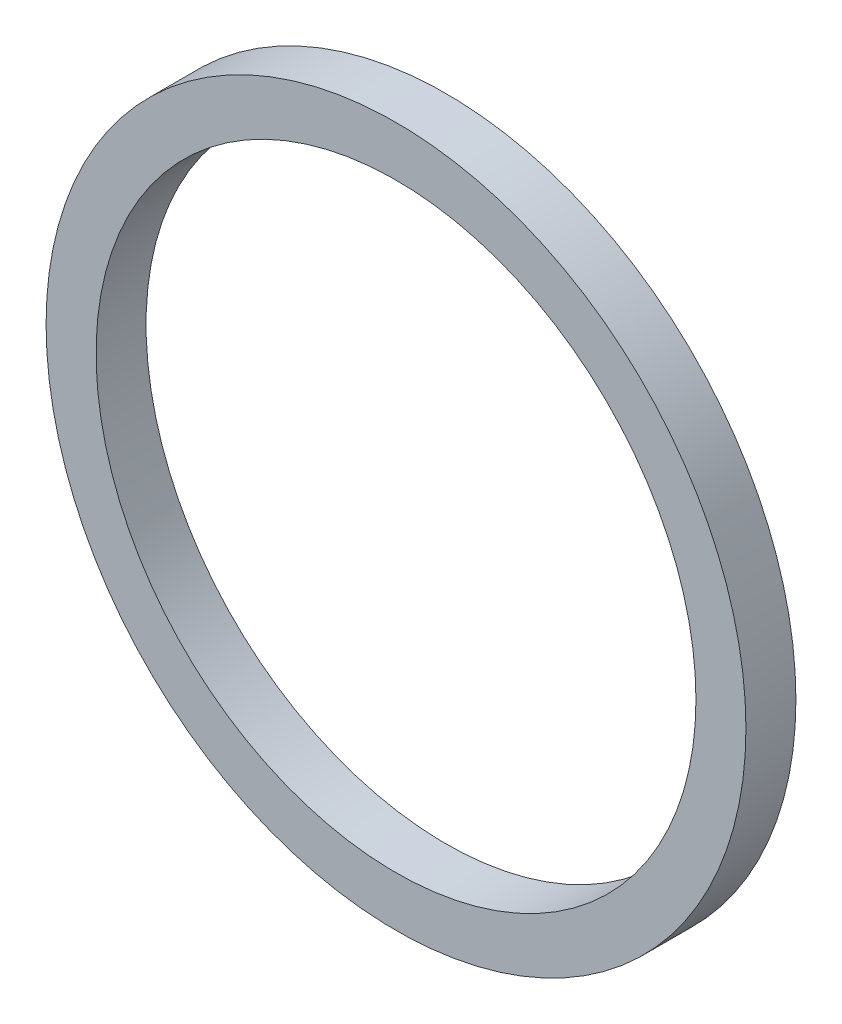
ISO-10303-21;
HEADER;
FILE_DESCRIPTION(('STEP AP214'),'2;1');
FILE_NAME('part.step','',(''),(''),'','','');
FILE_SCHEMA(('AUTOMOTIVE_DESIGN { 1 0 10303 214 1 1 1 1 }'));
ENDSEC;
DATA;
#1=APPLICATION_CONTEXT('core data for automotive mechanical design processes');
#2=APPLICATION_PROTOCOL_DEFINITION('international standard','automotive_design',2000,#1);
#3=PRODUCT_CONTEXT('',#1,'mechanical');
#4=PRODUCT('Part','Part','',(#3));
#5=PRODUCT_RELATED_PRODUCT_CATEGORY('part','',(#4));
#6=PRODUCT_DEFINITION_FORMATION('','',#4);
#7=PRODUCT_DEFINITION_CONTEXT('part definition',#1,'design');
#8=PRODUCT_DEFINITION('design','',#6,#7);
#9=PRODUCT_DEFINITION_SHAPE('','',#8);
#10=(LENGTH_UNIT() NAMED_UNIT(*) SI_UNIT(.MILLI.,.METRE.));
#11=(NAMED_UNIT(*) PLANE_ANGLE_UNIT() SI_UNIT($,.RADIAN.));
#12=(NAMED_UNIT(*) SI_UNIT($,.STERADIAN.) SOLID_ANGLE_UNIT());
#13=UNCERTAINTY_MEASURE_WITH_UNIT(LENGTH_MEASURE(1.E-05),#10,'distance_accuracy_value','');
#14=(GEOMETRIC_REPRESENTATION_CONTEXT(3) GLOBAL_UNCERTAINTY_ASSIGNED_CONTEXT((#13)) GLOBAL_UNIT_ASSIGNED_CONTEXT((#10,
#11,#12)) REPRESENTATION_CONTEXT('',''));
#15=CARTESIAN_POINT('',(0.,0.,0.));
#16=DIRECTION('',(0.,0.,1.));
#17=DIRECTION('',(1.,0.,0.));
#18=AXIS2_PLACEMENT_3D('',#15,#16,#17);
#19=CARTESIAN_POINT('',(0.,0.,1.));
#20=DIRECTION('',(0.,0.,1.));
#21=DIRECTION('',(1.,0.,0.));
#22=AXIS2_PLACEMENT_3D('',#19,#20,#21);
#23=PLANE('',#22);
#24=CARTESIAN_POINT('',(0.,0.,1.));
#25=DIRECTION('',(0.,0.,1.));
#26=DIRECTION('',(1.,0.,0.));
#27=AXIS2_PLACEMENT_3D('',#24,#25,#26);
#28=CIRCLE('',#27,7.);
#29=CARTESIAN_POINT('',(7.,0.,1.));
#30=VERTEX_POINT('',#29);
#31=EDGE_CURVE('E10',#30,#30,#28,.T.);
#32=ORIENTED_EDGE('',*,*,#31,.T.);
#33=EDGE_LOOP('',(#32));
#34=FACE_BOUND('',#33,.T.);
#35=CARTESIAN_POINT('',(0.,0.,1.));
#36=DIRECTION('',(0.,0.,1.));
#37=DIRECTION('',(1.,0.,0.));
#38=AXIS2_PLACEMENT_3D('',#35,#36,#37);
#39=CIRCLE('',#38,6.);
#40=CARTESIAN_POINT('',(6.,0.,1.));
#41=VERTEX_POINT('',#40);
#42=EDGE_CURVE('E43',#41,#41,#39,.T.);
#43=ORIENTED_EDGE('',*,*,#42,.F.);
#44=EDGE_LOOP('',(#43));
#45=FACE_BOUND('',#44,.T.);
#46=ADVANCED_FACE('F32',(#34,#45),#23,.T.);
#47=CARTESIAN_POINT('',(0.,0.,0.));
#48=DIRECTION('',(0.,0.,1.));
#49=DIRECTION('',(1.,0.,0.));
#50=AXIS2_PLACEMENT_3D('',#47,#48,#49);
#51=PLANE('',#50);
#52=CARTESIAN_POINT('',(0.,0.,0.));
#53=DIRECTION('',(0.,0.,1.));
#54=DIRECTION('',(1.,0.,0.));
#55=AXIS2_PLACEMENT_3D('',#52,#53,#54);
#56=CIRCLE('',#55,7.);
#57=CARTESIAN_POINT('',(7.,0.,0.));
#58=VERTEX_POINT('',#57);
#59=EDGE_CURVE('E36',#58,#58,#56,.T.);
#60=ORIENTED_EDGE('',*,*,#59,.F.);
#61=EDGE_LOOP('',(#60));
#62=FACE_BOUND('',#61,.T.);
#63=CARTESIAN_POINT('',(0.,0.,0.));
#64=DIRECTION('',(0.,0.,1.));
#65=DIRECTION('',(1.,0.,0.));
#66=AXIS2_PLACEMENT_3D('',#63,#64,#65);
#67=CIRCLE('',#66,6.);
#68=CARTESIAN_POINT('',(6.,0.,0.));
#69=VERTEX_POINT('',#68);
#70=EDGE_CURVE('E45',#69,#69,#67,.T.);
#71=ORIENTED_EDGE('',*,*,#70,.T.);
#72=EDGE_LOOP('',(#71));
#73=FACE_BOUND('',#72,.T.);
#74=ADVANCED_FACE('F55',(#62,#73),#51,.F.);
#75=CARTESIAN_POINT('',(0.,0.,1.));
#76=DIRECTION('',(0.,0.,-1.));
#77=DIRECTION('',(-1.,0.,0.));
#78=AXIS2_PLACEMENT_3D('',#75,#76,#77);
#79=CYLINDRICAL_SURFACE('',#78,7.);
#80=ORIENTED_EDGE('',*,*,#31,.F.);
#81=EDGE_LOOP('',(#80));
#82=FACE_BOUND('',#81,.T.);
#83=ORIENTED_EDGE('',*,*,#59,.T.);
#84=EDGE_LOOP('',(#83));
#85=FACE_BOUND('',#84,.T.);
#86=ADVANCED_FACE('F34',(#82,#85),#79,.T.);
#87=CARTESIAN_POINT('',(0.,0.,1.));
#88=DIRECTION('',(0.,0.,-1.));
#89=DIRECTION('',(-1.,0.,0.));
#90=AXIS2_PLACEMENT_3D('',#87,#88,#89);
#91=CYLINDRICAL_SURFACE('',#90,6.);
#92=ORIENTED_EDGE('',*,*,#42,.T.);
#93=EDGE_LOOP('',(#92));
#94=FACE_BOUND('',#93,.T.);
#95=ORIENTED_EDGE('',*,*,#70,.F.);
#96=EDGE_LOOP('',(#95));
#97=FACE_BOUND('',#96,.T.);
#98=ADVANCED_FACE('F51',(#94,#97),#91,.F.);
#99=CLOSED_SHELL('',(#46,#74,#86,#98));
#100=MANIFOLD_SOLID_BREP('B2',#99);
#101=ADVANCED_BREP_SHAPE_REPRESENTATION('',(#18,#100),#14);
#102=SHAPE_DEFINITION_REPRESENTATION(#9,#101);
ENDSEC;
END-ISO-10303-21;
